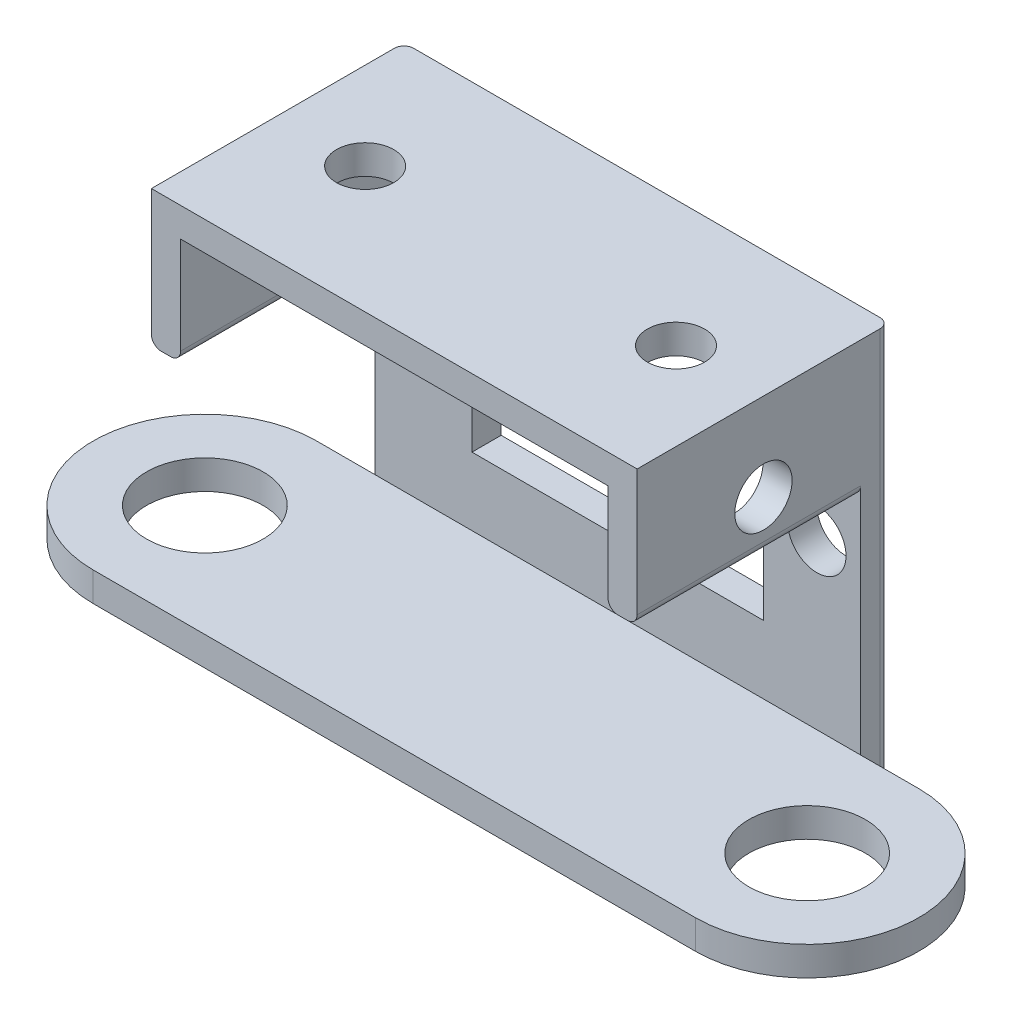
ISO-10303-21;
HEADER;
FILE_DESCRIPTION(('STEP AP214'),'2;1');
FILE_NAME('part.step','',(''),(''),'','','');
FILE_SCHEMA(('AUTOMOTIVE_DESIGN { 1 0 10303 214 1 1 1 1 }'));
ENDSEC;
DATA;
#1=APPLICATION_CONTEXT('core data for automotive mechanical design processes');
#2=APPLICATION_PROTOCOL_DEFINITION('international standard','automotive_design',2000,#1);
#3=PRODUCT_CONTEXT('',#1,'mechanical');
#4=PRODUCT('Part','Part','',(#3));
#5=PRODUCT_RELATED_PRODUCT_CATEGORY('part','',(#4));
#6=PRODUCT_DEFINITION_FORMATION('','',#4);
#7=PRODUCT_DEFINITION_CONTEXT('part definition',#1,'design');
#8=PRODUCT_DEFINITION('design','',#6,#7);
#9=PRODUCT_DEFINITION_SHAPE('','',#8);
#10=(LENGTH_UNIT() NAMED_UNIT(*) SI_UNIT(.MILLI.,.METRE.));
#11=(NAMED_UNIT(*) PLANE_ANGLE_UNIT() SI_UNIT($,.RADIAN.));
#12=(NAMED_UNIT(*) SI_UNIT($,.STERADIAN.) SOLID_ANGLE_UNIT());
#13=UNCERTAINTY_MEASURE_WITH_UNIT(LENGTH_MEASURE(1.E-05),#10,'distance_accuracy_value','');
#14=(GEOMETRIC_REPRESENTATION_CONTEXT(3) GLOBAL_UNCERTAINTY_ASSIGNED_CONTEXT((#13)) GLOBAL_UNIT_ASSIGNED_CONTEXT((#10,
#11,#12)) REPRESENTATION_CONTEXT('',''));
#15=CARTESIAN_POINT('',(0.,0.,0.));
#16=DIRECTION('',(0.,0.,1.));
#17=DIRECTION('',(1.,0.,0.));
#18=AXIS2_PLACEMENT_3D('',#15,#16,#17);
#19=CARTESIAN_POINT('',(-11.5,3.50000000000001,13.));
#20=DIRECTION('',(0.,0.,1.));
#21=DIRECTION('',(1.,0.,0.));
#22=AXIS2_PLACEMENT_3D('',#19,#20,#21);
#23=CYLINDRICAL_SURFACE('',#22,0.5);
#24=DIRECTION('',(0.,0.,1.));
#25=VECTOR('',#24,1.);
#26=CARTESIAN_POINT('',(-11.5,3.00000000000001,13.));
#27=LINE('',#26,#25);
#28=CARTESIAN_POINT('',(-11.5,3.00000000000001,1.5));
#29=VERTEX_POINT('',#28);
#30=CARTESIAN_POINT('',(-11.5,3.00000000000001,13.));
#31=VERTEX_POINT('',#30);
#32=EDGE_CURVE('E425',#29,#31,#27,.T.);
#33=ORIENTED_EDGE('',*,*,#32,.F.);
#34=CARTESIAN_POINT('',(-11.5,3.50000000000001,1.5));
#35=DIRECTION('',(0.,0.,1.));
#36=DIRECTION('',(1.,0.,0.));
#37=AXIS2_PLACEMENT_3D('',#34,#35,#36);
#38=CIRCLE('',#37,0.5);
#39=CARTESIAN_POINT('',(-11.,3.5,1.5));
#40=VERTEX_POINT('',#39);
#41=EDGE_CURVE('E11',#29,#40,#38,.T.);
#42=ORIENTED_EDGE('',*,*,#41,.T.);
#43=DIRECTION('',(0.,0.,1.));
#44=VECTOR('',#43,1.);
#45=CARTESIAN_POINT('',(-11.,3.5,13.));
#46=LINE('',#45,#44);
#47=CARTESIAN_POINT('',(-11.,3.5,13.));
#48=VERTEX_POINT('',#47);
#49=EDGE_CURVE('E428',#48,#40,#46,.F.);
#50=ORIENTED_EDGE('',*,*,#49,.F.);
#51=CARTESIAN_POINT('',(-11.5,3.50000000000001,13.));
#52=DIRECTION('',(0.,0.,1.));
#53=DIRECTION('',(1.,0.,0.));
#54=AXIS2_PLACEMENT_3D('',#51,#52,#53);
#55=CIRCLE('',#54,0.5);
#56=EDGE_CURVE('E48',#31,#48,#55,.T.);
#57=ORIENTED_EDGE('',*,*,#56,.F.);
#58=EDGE_LOOP('',(#33,#42,#50,#57));
#59=FACE_BOUND('',#58,.T.);
#60=ADVANCED_FACE('F41',(#59),#23,.T.);
#61=CARTESIAN_POINT('',(-12.,3.5,13.));
#62=DIRECTION('',(0.,0.,1.));
#63=DIRECTION('',(1.,0.,0.));
#64=AXIS2_PLACEMENT_3D('',#61,#62,#63);
#65=CYLINDRICAL_SURFACE('',#64,0.5);
#66=DIRECTION('',(0.,0.,1.));
#67=VECTOR('',#66,1.);
#68=CARTESIAN_POINT('',(-12.5,3.5,13.));
#69=LINE('',#68,#67);
#70=CARTESIAN_POINT('',(-12.5,3.5,1.5));
#71=VERTEX_POINT('',#70);
#72=CARTESIAN_POINT('',(-12.5,3.5,13.));
#73=VERTEX_POINT('',#72);
#74=EDGE_CURVE('E415',#71,#73,#69,.T.);
#75=ORIENTED_EDGE('',*,*,#74,.F.);
#76=CARTESIAN_POINT('',(-12.,3.5,1.5));
#77=DIRECTION('',(0.,0.,1.));
#78=DIRECTION('',(1.,0.,0.));
#79=AXIS2_PLACEMENT_3D('',#76,#77,#78);
#80=CIRCLE('',#79,0.5);
#81=CARTESIAN_POINT('',(-12.,3.00000000000001,1.5));
#82=VERTEX_POINT('',#81);
#83=EDGE_CURVE('E423',#71,#82,#80,.T.);
#84=ORIENTED_EDGE('',*,*,#83,.T.);
#85=DIRECTION('',(0.,0.,1.));
#86=VECTOR('',#85,1.);
#87=CARTESIAN_POINT('',(-12.,3.00000000000001,13.));
#88=LINE('',#87,#86);
#89=CARTESIAN_POINT('',(-12.,3.00000000000001,13.));
#90=VERTEX_POINT('',#89);
#91=EDGE_CURVE('E418',#90,#82,#88,.F.);
#92=ORIENTED_EDGE('',*,*,#91,.F.);
#93=CARTESIAN_POINT('',(-12.,3.5,13.));
#94=DIRECTION('',(0.,0.,1.));
#95=DIRECTION('',(1.,0.,0.));
#96=AXIS2_PLACEMENT_3D('',#93,#94,#95);
#97=CIRCLE('',#96,0.5);
#98=EDGE_CURVE('E421',#73,#90,#97,.T.);
#99=ORIENTED_EDGE('',*,*,#98,.F.);
#100=EDGE_LOOP('',(#75,#84,#92,#99));
#101=FACE_BOUND('',#100,.T.);
#102=ADVANCED_FACE('F503',(#101),#65,.T.);
#103=CARTESIAN_POINT('',(11.5,3.5,13.));
#104=DIRECTION('',(0.,0.,1.));
#105=DIRECTION('',(1.,0.,0.));
#106=AXIS2_PLACEMENT_3D('',#103,#104,#105);
#107=CYLINDRICAL_SURFACE('',#106,0.5);
#108=DIRECTION('',(0.,0.,1.));
#109=VECTOR('',#108,1.);
#110=CARTESIAN_POINT('',(11.,3.5,13.));
#111=LINE('',#110,#109);
#112=CARTESIAN_POINT('',(11.,3.5,1.5));
#113=VERTEX_POINT('',#112);
#114=CARTESIAN_POINT('',(11.,3.5,13.));
#115=VERTEX_POINT('',#114);
#116=EDGE_CURVE('E405',#113,#115,#111,.T.);
#117=ORIENTED_EDGE('',*,*,#116,.F.);
#118=CARTESIAN_POINT('',(11.5,3.5,1.5));
#119=DIRECTION('',(0.,0.,1.));
#120=DIRECTION('',(1.,0.,0.));
#121=AXIS2_PLACEMENT_3D('',#118,#119,#120);
#122=CIRCLE('',#121,0.5);
#123=CARTESIAN_POINT('',(11.5,3.00000000000001,1.5));
#124=VERTEX_POINT('',#123);
#125=EDGE_CURVE('E413',#113,#124,#122,.T.);
#126=ORIENTED_EDGE('',*,*,#125,.T.);
#127=DIRECTION('',(0.,0.,1.));
#128=VECTOR('',#127,1.);
#129=CARTESIAN_POINT('',(11.5,3.00000000000001,13.));
#130=LINE('',#129,#128);
#131=CARTESIAN_POINT('',(11.5,3.00000000000001,13.));
#132=VERTEX_POINT('',#131);
#133=EDGE_CURVE('E408',#132,#124,#130,.F.);
#134=ORIENTED_EDGE('',*,*,#133,.F.);
#135=CARTESIAN_POINT('',(11.5,3.5,13.));
#136=DIRECTION('',(0.,0.,1.));
#137=DIRECTION('',(1.,0.,0.));
#138=AXIS2_PLACEMENT_3D('',#135,#136,#137);
#139=CIRCLE('',#138,0.5);
#140=EDGE_CURVE('E411',#115,#132,#139,.T.);
#141=ORIENTED_EDGE('',*,*,#140,.F.);
#142=EDGE_LOOP('',(#117,#126,#134,#141));
#143=FACE_BOUND('',#142,.T.);
#144=ADVANCED_FACE('F440',(#143),#107,.T.);
#145=CARTESIAN_POINT('',(12.,3.5,13.));
#146=DIRECTION('',(0.,0.,-1.));
#147=DIRECTION('',(-1.,0.,0.));
#148=AXIS2_PLACEMENT_3D('',#145,#146,#147);
#149=CYLINDRICAL_SURFACE('',#148,0.5);
#150=DIRECTION('',(0.,0.,-1.));
#151=VECTOR('',#150,1.);
#152=CARTESIAN_POINT('',(12.5,3.5,13.));
#153=LINE('',#152,#151);
#154=CARTESIAN_POINT('',(12.5,3.5,13.));
#155=VERTEX_POINT('',#154);
#156=CARTESIAN_POINT('',(12.5,3.5,1.5));
#157=VERTEX_POINT('',#156);
#158=EDGE_CURVE('E394',#155,#157,#153,.T.);
#159=ORIENTED_EDGE('',*,*,#158,.F.);
#160=CARTESIAN_POINT('',(12.,3.5,13.));
#161=DIRECTION('',(0.,0.,1.));
#162=DIRECTION('',(1.,0.,0.));
#163=AXIS2_PLACEMENT_3D('',#160,#161,#162);
#164=CIRCLE('',#163,0.5);
#165=CARTESIAN_POINT('',(12.,3.00000000000001,13.));
#166=VERTEX_POINT('',#165);
#167=EDGE_CURVE('E400',#166,#155,#164,.T.);
#168=ORIENTED_EDGE('',*,*,#167,.F.);
#169=DIRECTION('',(0.,0.,-1.));
#170=VECTOR('',#169,1.);
#171=CARTESIAN_POINT('',(12.,3.00000000000001,13.));
#172=LINE('',#171,#170);
#173=CARTESIAN_POINT('',(12.,3.00000000000001,1.5));
#174=VERTEX_POINT('',#173);
#175=EDGE_CURVE('E397',#174,#166,#172,.F.);
#176=ORIENTED_EDGE('',*,*,#175,.F.);
#177=CARTESIAN_POINT('',(12.,3.5,1.5));
#178=DIRECTION('',(0.,0.,1.));
#179=DIRECTION('',(1.,0.,0.));
#180=AXIS2_PLACEMENT_3D('',#177,#178,#179);
#181=CIRCLE('',#180,0.5);
#182=EDGE_CURVE('E402',#174,#157,#181,.T.);
#183=ORIENTED_EDGE('',*,*,#182,.T.);
#184=EDGE_LOOP('',(#159,#168,#176,#183));
#185=FACE_BOUND('',#184,.T.);
#186=ADVANCED_FACE('F448',(#185),#149,.T.);
#187=CARTESIAN_POINT('',(12.,0.,0.5));
#188=DIRECTION('',(0.,-1.,0.));
#189=DIRECTION('',(1.,0.,0.));
#190=AXIS2_PLACEMENT_3D('',#187,#188,#189);
#191=CYLINDRICAL_SURFACE('',#190,0.5);
#192=DIRECTION('',(0.,-1.,0.));
#193=VECTOR('',#192,1.);
#194=CARTESIAN_POINT('',(12.,0.,0.));
#195=LINE('',#194,#193);
#196=CARTESIAN_POINT('',(12.,10.,0.));
#197=VERTEX_POINT('',#196);
#198=CARTESIAN_POINT('',(12.,-10.,0.));
#199=VERTEX_POINT('',#198);
#200=EDGE_CURVE('E384',#197,#199,#195,.T.);
#201=ORIENTED_EDGE('',*,*,#200,.F.);
#202=CARTESIAN_POINT('',(12.,10.,0.5));
#203=DIRECTION('',(0.,-1.,0.));
#204=DIRECTION('',(0.,0.,-1.));
#205=AXIS2_PLACEMENT_3D('',#202,#203,#204);
#206=CIRCLE('',#205,0.5);
#207=CARTESIAN_POINT('',(12.5,10.,0.5));
#208=VERTEX_POINT('',#207);
#209=EDGE_CURVE('E390',#208,#197,#206,.F.);
#210=ORIENTED_EDGE('',*,*,#209,.F.);
#211=DIRECTION('',(0.,-1.,0.));
#212=VECTOR('',#211,1.);
#213=CARTESIAN_POINT('',(12.5,10.,0.5));
#214=LINE('',#213,#212);
#215=CARTESIAN_POINT('',(12.5,-10.,0.5));
#216=VERTEX_POINT('',#215);
#217=EDGE_CURVE('E387',#216,#208,#214,.F.);
#218=ORIENTED_EDGE('',*,*,#217,.F.);
#219=CARTESIAN_POINT('',(12.,-10.,0.5));
#220=DIRECTION('',(0.,1.,0.));
#221=DIRECTION('',(0.,0.,1.));
#222=AXIS2_PLACEMENT_3D('',#219,#220,#221);
#223=CIRCLE('',#222,0.5);
#224=EDGE_CURVE('E392',#199,#216,#223,.F.);
#225=ORIENTED_EDGE('',*,*,#224,.F.);
#226=EDGE_LOOP('',(#201,#210,#218,#225));
#227=FACE_BOUND('',#226,.T.);
#228=ADVANCED_FACE('F536',(#227),#191,.T.);
#229=CARTESIAN_POINT('',(-12.,10.,0.5));
#230=DIRECTION('',(0.,-1.,0.));
#231=DIRECTION('',(1.,0.,0.));
#232=AXIS2_PLACEMENT_3D('',#229,#230,#231);
#233=CYLINDRICAL_SURFACE('',#232,0.5);
#234=DIRECTION('',(0.,-1.,0.));
#235=VECTOR('',#234,1.);
#236=CARTESIAN_POINT('',(-12.5,10.,0.5));
#237=LINE('',#236,#235);
#238=CARTESIAN_POINT('',(-12.5,10.,0.5));
#239=VERTEX_POINT('',#238);
#240=CARTESIAN_POINT('',(-12.5,-10.,0.5));
#241=VERTEX_POINT('',#240);
#242=EDGE_CURVE('E369',#239,#241,#237,.T.);
#243=ORIENTED_EDGE('',*,*,#242,.F.);
#244=CARTESIAN_POINT('',(-12.,10.,0.5));
#245=DIRECTION('',(0.,-1.,0.));
#246=DIRECTION('',(0.,0.,-1.));
#247=AXIS2_PLACEMENT_3D('',#244,#245,#246);
#248=CIRCLE('',#247,0.5);
#249=CARTESIAN_POINT('',(-12.,10.,0.));
#250=VERTEX_POINT('',#249);
#251=EDGE_CURVE('E380',#250,#239,#248,.F.);
#252=ORIENTED_EDGE('',*,*,#251,.F.);
#253=DIRECTION('',(0.,-1.,0.));
#254=VECTOR('',#253,1.);
#255=CARTESIAN_POINT('',(-12.,0.,0.));
#256=LINE('',#255,#254);
#257=CARTESIAN_POINT('',(-12.,-10.,0.));
#258=VERTEX_POINT('',#257);
#259=EDGE_CURVE('E377',#258,#250,#256,.F.);
#260=ORIENTED_EDGE('',*,*,#259,.F.);
#261=CARTESIAN_POINT('',(-12.,-10.,0.5));
#262=DIRECTION('',(0.,1.,0.));
#263=DIRECTION('',(0.,0.,1.));
#264=AXIS2_PLACEMENT_3D('',#261,#262,#263);
#265=CIRCLE('',#264,0.5);
#266=EDGE_CURVE('E382',#241,#258,#265,.F.);
#267=ORIENTED_EDGE('',*,*,#266,.F.);
#268=EDGE_LOOP('',(#243,#252,#260,#267));
#269=FACE_BOUND('',#268,.T.);
#270=ADVANCED_FACE('F541',(#269),#233,.T.);
#271=CARTESIAN_POINT('',(0.,0.,1.5));
#272=DIRECTION('',(0.,0.,1.));
#273=DIRECTION('',(1.,0.,0.));
#274=AXIS2_PLACEMENT_3D('',#271,#272,#273);
#275=PLANE('',#274);
#276=CARTESIAN_POINT('',(10.25,0.,1.5));
#277=DIRECTION('',(0.,0.,1.));
#278=DIRECTION('',(1.,0.,0.));
#279=AXIS2_PLACEMENT_3D('',#276,#277,#278);
#280=CIRCLE('',#279,1.5);
#281=CARTESIAN_POINT('',(11.75,0.,1.5));
#282=VERTEX_POINT('',#281);
#283=EDGE_CURVE('E364',#282,#282,#280,.T.);
#284=ORIENTED_EDGE('',*,*,#283,.F.);
#285=EDGE_LOOP('',(#284));
#286=FACE_BOUND('',#285,.T.);
#287=DIRECTION('',(0.,1.,0.));
#288=VECTOR('',#287,1.);
#289=CARTESIAN_POINT('',(7.5,5.,1.5));
#290=LINE('',#289,#288);
#291=CARTESIAN_POINT('',(7.5,-5.,1.5));
#292=VERTEX_POINT('',#291);
#293=CARTESIAN_POINT('',(7.5,5.,1.5));
#294=VERTEX_POINT('',#293);
#295=EDGE_CURVE('E301',#292,#294,#290,.T.);
#296=ORIENTED_EDGE('',*,*,#295,.F.);
#297=DIRECTION('',(1.,0.,0.));
#298=VECTOR('',#297,1.);
#299=CARTESIAN_POINT('',(-7.5,-5.,1.5));
#300=LINE('',#299,#298);
#301=CARTESIAN_POINT('',(-7.5,-5.,1.5));
#302=VERTEX_POINT('',#301);
#303=EDGE_CURVE('E309',#302,#292,#300,.T.);
#304=ORIENTED_EDGE('',*,*,#303,.F.);
#305=DIRECTION('',(0.,-1.,0.));
#306=VECTOR('',#305,1.);
#307=CARTESIAN_POINT('',(-7.5,5.,1.5));
#308=LINE('',#307,#306);
#309=CARTESIAN_POINT('',(-7.5,5.,1.5));
#310=VERTEX_POINT('',#309);
#311=EDGE_CURVE('E306',#310,#302,#308,.T.);
#312=ORIENTED_EDGE('',*,*,#311,.F.);
#313=DIRECTION('',(-1.,0.,0.));
#314=VECTOR('',#313,1.);
#315=CARTESIAN_POINT('',(-7.5,5.,1.5));
#316=LINE('',#315,#314);
#317=EDGE_CURVE('E303',#294,#310,#316,.T.);
#318=ORIENTED_EDGE('',*,*,#317,.F.);
#319=EDGE_LOOP('',(#296,#304,#312,#318));
#320=FACE_BOUND('',#319,.T.);
#321=CARTESIAN_POINT('',(-10.25,0.,1.5));
#322=DIRECTION('',(0.,0.,1.));
#323=DIRECTION('',(1.,0.,0.));
#324=AXIS2_PLACEMENT_3D('',#321,#322,#323);
#325=CIRCLE('',#324,1.5);
#326=CARTESIAN_POINT('',(-8.75,0.,1.5));
#327=VERTEX_POINT('',#326);
#328=EDGE_CURVE('E336',#327,#327,#325,.T.);
#329=ORIENTED_EDGE('',*,*,#328,.F.);
#330=EDGE_LOOP('',(#329));
#331=FACE_BOUND('',#330,.T.);
#332=DIRECTION('',(0.,1.,0.));
#333=VECTOR('',#332,1.);
#334=CARTESIAN_POINT('',(-11.,8.5,1.5));
#335=LINE('',#334,#333);
#336=CARTESIAN_POINT('',(-11.,8.5,1.5));
#337=VERTEX_POINT('',#336);
#338=EDGE_CURVE('E216',#40,#337,#335,.T.);
#339=ORIENTED_EDGE('',*,*,#338,.F.);
#340=ORIENTED_EDGE('',*,*,#41,.F.);
#341=DIRECTION('',(1.,0.,0.));
#342=VECTOR('',#341,1.);
#343=CARTESIAN_POINT('',(-11.,3.00000000000001,1.5));
#344=LINE('',#343,#342);
#345=EDGE_CURVE('E237',#82,#29,#344,.T.);
#346=ORIENTED_EDGE('',*,*,#345,.F.);
#347=ORIENTED_EDGE('',*,*,#83,.F.);
#348=DIRECTION('',(0.,1.,0.));
#349=VECTOR('',#348,1.);
#350=CARTESIAN_POINT('',(-12.5,10.,1.5));
#351=LINE('',#350,#349);
#352=CARTESIAN_POINT('',(-12.5,-8.5,1.5));
#353=VERTEX_POINT('',#352);
#354=EDGE_CURVE('E297',#353,#71,#351,.T.);
#355=ORIENTED_EDGE('',*,*,#354,.F.);
#356=DIRECTION('',(1.,0.,0.));
#357=VECTOR('',#356,1.);
#358=CARTESIAN_POINT('',(-12.5,-8.5,1.5));
#359=LINE('',#358,#357);
#360=CARTESIAN_POINT('',(12.5,-8.49999999999999,1.5));
#361=VERTEX_POINT('',#360);
#362=EDGE_CURVE('E340',#353,#361,#359,.T.);
#363=ORIENTED_EDGE('',*,*,#362,.T.);
#364=DIRECTION('',(0.,-1.,0.));
#365=VECTOR('',#364,1.);
#366=CARTESIAN_POINT('',(12.5,10.,1.5));
#367=LINE('',#366,#365);
#368=EDGE_CURVE('E299',#157,#361,#367,.T.);
#369=ORIENTED_EDGE('',*,*,#368,.F.);
#370=ORIENTED_EDGE('',*,*,#182,.F.);
#371=DIRECTION('',(1.,0.,0.));
#372=VECTOR('',#371,1.);
#373=CARTESIAN_POINT('',(11.,3.00000000000001,1.5));
#374=LINE('',#373,#372);
#375=EDGE_CURVE('E247',#124,#174,#374,.T.);
#376=ORIENTED_EDGE('',*,*,#375,.F.);
#377=ORIENTED_EDGE('',*,*,#125,.F.);
#378=DIRECTION('',(0.,-1.,0.));
#379=VECTOR('',#378,1.);
#380=CARTESIAN_POINT('',(11.,8.5,1.5));
#381=LINE('',#380,#379);
#382=CARTESIAN_POINT('',(11.,8.5,1.5));
#383=VERTEX_POINT('',#382);
#384=EDGE_CURVE('E244',#383,#113,#381,.T.);
#385=ORIENTED_EDGE('',*,*,#384,.F.);
#386=DIRECTION('',(1.,0.,0.));
#387=VECTOR('',#386,1.);
#388=CARTESIAN_POINT('',(-11.,8.5,1.5));
#389=LINE('',#388,#387);
#390=EDGE_CURVE('E242',#337,#383,#389,.T.);
#391=ORIENTED_EDGE('',*,*,#390,.F.);
#392=EDGE_LOOP('',(#339,#340,#346,#347,#355,#363,#369,#370,#376,#377,#385,#391));
#393=FACE_BOUND('',#392,.T.);
#394=ADVANCED_FACE('F430',(#286,#320,#331,#393),#275,.T.);
#395=CARTESIAN_POINT('',(12.5,10.,13.));
#396=DIRECTION('',(-1.,0.,0.));
#397=DIRECTION('',(0.,-1.,0.));
#398=AXIS2_PLACEMENT_3D('',#395,#396,#397);
#399=PLANE('',#398);
#400=CARTESIAN_POINT('',(12.5,5.5,6.5));
#401=DIRECTION('',(-1.,0.,0.));
#402=DIRECTION('',(0.,-1.,0.));
#403=AXIS2_PLACEMENT_3D('',#400,#401,#402);
#404=CIRCLE('',#403,1.475);
#405=CARTESIAN_POINT('',(12.5,4.025,6.5));
#406=VERTEX_POINT('',#405);
#407=EDGE_CURVE('E475',#406,#406,#404,.T.);
#408=ORIENTED_EDGE('',*,*,#407,.T.);
#409=EDGE_LOOP('',(#408));
#410=FACE_BOUND('',#409,.T.);
#411=DIRECTION('',(0.,1.,0.));
#412=VECTOR('',#411,1.);
#413=CARTESIAN_POINT('',(12.5,3.00000000000001,13.));
#414=LINE('',#413,#412);
#415=CARTESIAN_POINT('',(12.5,10.,13.));
#416=VERTEX_POINT('',#415);
#417=EDGE_CURVE('E232',#155,#416,#414,.T.);
#418=ORIENTED_EDGE('',*,*,#417,.F.);
#419=ORIENTED_EDGE('',*,*,#158,.T.);
#420=ORIENTED_EDGE('',*,*,#368,.T.);
#421=DIRECTION('',(0.,-1.,0.));
#422=VECTOR('',#421,1.);
#423=CARTESIAN_POINT('',(12.5,10.,1.5));
#424=LINE('',#423,#422);
#425=CARTESIAN_POINT('',(12.5,-10.,1.50000000000003));
#426=VERTEX_POINT('',#425);
#427=EDGE_CURVE('E295',#361,#426,#424,.T.);
#428=ORIENTED_EDGE('',*,*,#427,.T.);
#429=DIRECTION('',(0.,0.,-1.));
#430=VECTOR('',#429,1.);
#431=CARTESIAN_POINT('',(12.5,-10.,13.));
#432=LINE('',#431,#430);
#433=EDGE_CURVE('E348',#426,#216,#432,.T.);
#434=ORIENTED_EDGE('',*,*,#433,.T.);
#435=ORIENTED_EDGE('',*,*,#217,.T.);
#436=DIRECTION('',(0.,0.,-1.));
#437=VECTOR('',#436,1.);
#438=CARTESIAN_POINT('',(12.5,10.,13.));
#439=LINE('',#438,#437);
#440=EDGE_CURVE('E361',#416,#208,#439,.T.);
#441=ORIENTED_EDGE('',*,*,#440,.F.);
#442=EDGE_LOOP('',(#418,#419,#420,#428,#434,#435,#441));
#443=FACE_BOUND('',#442,.T.);
#444=ADVANCED_FACE('F455',(#410,#443),#399,.F.);
#445=CARTESIAN_POINT('',(-12.5,10.,13.));
#446=DIRECTION('',(0.,-1.,0.));
#447=DIRECTION('',(0.,0.,-1.));
#448=AXIS2_PLACEMENT_3D('',#445,#446,#447);
#449=PLANE('',#448);
#450=CARTESIAN_POINT('',(8.,10.,6.5));
#451=DIRECTION('',(0.,1.,0.));
#452=DIRECTION('',(0.,0.,-1.));
#453=AXIS2_PLACEMENT_3D('',#450,#451,#452);
#454=CIRCLE('',#453,1.475);
#455=CARTESIAN_POINT('',(8.,10.,5.025));
#456=VERTEX_POINT('',#455);
#457=EDGE_CURVE('E472',#456,#456,#454,.T.);
#458=ORIENTED_EDGE('',*,*,#457,.F.);
#459=EDGE_LOOP('',(#458));
#460=FACE_BOUND('',#459,.T.);
#461=CARTESIAN_POINT('',(-8.,10.,6.5));
#462=DIRECTION('',(0.,1.,0.));
#463=DIRECTION('',(0.,0.,1.));
#464=AXIS2_PLACEMENT_3D('',#461,#462,#463);
#465=CIRCLE('',#464,1.475);
#466=CARTESIAN_POINT('',(-8.,10.,7.975));
#467=VERTEX_POINT('',#466);
#468=EDGE_CURVE('E466',#467,#467,#465,.T.);
#469=ORIENTED_EDGE('',*,*,#468,.F.);
#470=EDGE_LOOP('',(#469));
#471=FACE_BOUND('',#470,.T.);
#472=ORIENTED_EDGE('',*,*,#440,.T.);
#473=ORIENTED_EDGE('',*,*,#209,.T.);
#474=DIRECTION('',(-1.,0.,0.));
#475=VECTOR('',#474,1.);
#476=CARTESIAN_POINT('',(-12.5,10.,0.));
#477=LINE('',#476,#475);
#478=EDGE_CURVE('E345',#197,#250,#477,.T.);
#479=ORIENTED_EDGE('',*,*,#478,.T.);
#480=ORIENTED_EDGE('',*,*,#251,.T.);
#481=DIRECTION('',(0.,0.,-1.));
#482=VECTOR('',#481,1.);
#483=CARTESIAN_POINT('',(-12.5,10.,13.));
#484=LINE('',#483,#482);
#485=CARTESIAN_POINT('',(-12.5,10.,13.));
#486=VERTEX_POINT('',#485);
#487=EDGE_CURVE('E358',#486,#239,#484,.T.);
#488=ORIENTED_EDGE('',*,*,#487,.F.);
#489=DIRECTION('',(-1.,0.,0.));
#490=VECTOR('',#489,1.);
#491=CARTESIAN_POINT('',(12.5,10.,13.));
#492=LINE('',#491,#490);
#493=EDGE_CURVE('E234',#416,#486,#492,.T.);
#494=ORIENTED_EDGE('',*,*,#493,.F.);
#495=EDGE_LOOP('',(#472,#473,#479,#480,#488,#494));
#496=FACE_BOUND('',#495,.T.);
#497=ADVANCED_FACE('F458',(#460,#471,#496),#449,.F.);
#498=CARTESIAN_POINT('',(-12.5,10.,13.));
#499=DIRECTION('',(1.,0.,0.));
#500=DIRECTION('',(0.,1.,0.));
#501=AXIS2_PLACEMENT_3D('',#498,#499,#500);
#502=PLANE('',#501);
#503=CARTESIAN_POINT('',(-12.5,5.5,6.5));
#504=DIRECTION('',(-1.,0.,0.));
#505=DIRECTION('',(0.,-1.,0.));
#506=AXIS2_PLACEMENT_3D('',#503,#504,#505);
#507=CIRCLE('',#506,1.475);
#508=CARTESIAN_POINT('',(-12.5,4.025,6.5));
#509=VERTEX_POINT('',#508);
#510=EDGE_CURVE('E374',#509,#509,#507,.T.);
#511=ORIENTED_EDGE('',*,*,#510,.F.);
#512=EDGE_LOOP('',(#511));
#513=FACE_BOUND('',#512,.T.);
#514=ORIENTED_EDGE('',*,*,#354,.T.);
#515=ORIENTED_EDGE('',*,*,#74,.T.);
#516=DIRECTION('',(0.,-1.,0.));
#517=VECTOR('',#516,1.);
#518=CARTESIAN_POINT('',(-12.5,3.00000000000001,13.));
#519=LINE('',#518,#517);
#520=EDGE_CURVE('E249',#486,#73,#519,.T.);
#521=ORIENTED_EDGE('',*,*,#520,.F.);
#522=ORIENTED_EDGE('',*,*,#487,.T.);
#523=ORIENTED_EDGE('',*,*,#242,.T.);
#524=DIRECTION('',(0.,0.,-1.));
#525=VECTOR('',#524,1.);
#526=CARTESIAN_POINT('',(-12.5,-10.,13.));
#527=LINE('',#526,#525);
#528=CARTESIAN_POINT('',(-12.5,-10.,1.50000000000003));
#529=VERTEX_POINT('',#528);
#530=EDGE_CURVE('E355',#529,#241,#527,.T.);
#531=ORIENTED_EDGE('',*,*,#530,.F.);
#532=DIRECTION('',(0.,1.,0.));
#533=VECTOR('',#532,1.);
#534=CARTESIAN_POINT('',(-12.5,10.,1.50000000000005));
#535=LINE('',#534,#533);
#536=EDGE_CURVE('E285',#529,#353,#535,.T.);
#537=ORIENTED_EDGE('',*,*,#536,.T.);
#538=EDGE_LOOP('',(#514,#515,#521,#522,#523,#531,#537));
#539=FACE_BOUND('',#538,.T.);
#540=ADVANCED_FACE('F462',(#513,#539),#502,.F.);
#541=CARTESIAN_POINT('',(-12.5,-10.,13.));
#542=DIRECTION('',(0.,1.,0.));
#543=DIRECTION('',(0.,0.,1.));
#544=AXIS2_PLACEMENT_3D('',#541,#542,#543);
#545=PLANE('',#544);
#546=CARTESIAN_POINT('',(15.5,-10.,7.25));
#547=DIRECTION('',(0.,1.,0.));
#548=DIRECTION('',(0.,0.,1.));
#549=AXIS2_PLACEMENT_3D('',#546,#547,#548);
#550=CIRCLE('',#549,3.);
#551=CARTESIAN_POINT('',(15.5,-10.,10.25));
#552=VERTEX_POINT('',#551);
#553=EDGE_CURVE('E265',#552,#552,#550,.F.);
#554=ORIENTED_EDGE('',*,*,#553,.F.);
#555=EDGE_LOOP('',(#554));
#556=FACE_BOUND('',#555,.T.);
#557=CARTESIAN_POINT('',(-15.5,-10.,7.25));
#558=DIRECTION('',(0.,1.,0.));
#559=DIRECTION('',(0.,0.,1.));
#560=AXIS2_PLACEMENT_3D('',#557,#558,#559);
#561=CIRCLE('',#560,3.);
#562=CARTESIAN_POINT('',(-15.5,-10.,10.25));
#563=VERTEX_POINT('',#562);
#564=EDGE_CURVE('E251',#563,#563,#561,.T.);
#565=ORIENTED_EDGE('',*,*,#564,.T.);
#566=EDGE_LOOP('',(#565));
#567=FACE_BOUND('',#566,.T.);
#568=DIRECTION('',(1.,0.,0.));
#569=VECTOR('',#568,1.);
#570=CARTESIAN_POINT('',(-12.5,-10.,0.));
#571=LINE('',#570,#569);
#572=EDGE_CURVE('E349',#258,#199,#571,.T.);
#573=ORIENTED_EDGE('',*,*,#572,.T.);
#574=ORIENTED_EDGE('',*,*,#224,.T.);
#575=ORIENTED_EDGE('',*,*,#433,.F.);
#576=DIRECTION('',(-1.,0.,0.));
#577=VECTOR('',#576,1.);
#578=CARTESIAN_POINT('',(0.,-10.,1.50000000000002));
#579=LINE('',#578,#577);
#580=CARTESIAN_POINT('',(15.5,-10.,1.49999999999999));
#581=VERTEX_POINT('',#580);
#582=EDGE_CURVE('E256',#581,#426,#579,.T.);
#583=ORIENTED_EDGE('',*,*,#582,.F.);
#584=CARTESIAN_POINT('',(15.5,-10.,7.25));
#585=DIRECTION('',(0.,1.,0.));
#586=DIRECTION('',(0.,0.,1.));
#587=AXIS2_PLACEMENT_3D('',#584,#585,#586);
#588=CIRCLE('',#587,5.75);
#589=CARTESIAN_POINT('',(15.5,-10.,13.));
#590=VERTEX_POINT('',#589);
#591=EDGE_CURVE('E262',#581,#590,#588,.F.);
#592=ORIENTED_EDGE('',*,*,#591,.T.);
#593=DIRECTION('',(1.,0.,0.));
#594=VECTOR('',#593,1.);
#595=CARTESIAN_POINT('',(-12.5,-10.,13.));
#596=LINE('',#595,#594);
#597=CARTESIAN_POINT('',(-15.5,-10.,13.));
#598=VERTEX_POINT('',#597);
#599=EDGE_CURVE('E346',#598,#590,#596,.T.);
#600=ORIENTED_EDGE('',*,*,#599,.F.);
#601=CARTESIAN_POINT('',(-15.5,-10.,7.25));
#602=DIRECTION('',(0.,1.,0.));
#603=DIRECTION('',(0.,0.,1.));
#604=AXIS2_PLACEMENT_3D('',#601,#602,#603);
#605=CIRCLE('',#604,5.75);
#606=CARTESIAN_POINT('',(-15.5,-10.,1.5));
#607=VERTEX_POINT('',#606);
#608=EDGE_CURVE('E259',#607,#598,#605,.T.);
#609=ORIENTED_EDGE('',*,*,#608,.F.);
#610=EDGE_CURVE('E254',#529,#607,#579,.T.);
#611=ORIENTED_EDGE('',*,*,#610,.F.);
#612=ORIENTED_EDGE('',*,*,#530,.T.);
#613=ORIENTED_EDGE('',*,*,#266,.T.);
#614=EDGE_LOOP('',(#573,#574,#575,#583,#592,#600,#609,#611,#612,#613));
#615=FACE_BOUND('',#614,.T.);
#616=ADVANCED_FACE('F489',(#556,#567,#615),#545,.F.);
#617=CARTESIAN_POINT('',(0.,0.,13.));
#618=DIRECTION('',(0.,0.,1.));
#619=DIRECTION('',(1.,0.,0.));
#620=AXIS2_PLACEMENT_3D('',#617,#618,#619);
#621=PLANE('',#620);
#622=DIRECTION('',(1.,0.,0.));
#623=VECTOR('',#622,1.);
#624=CARTESIAN_POINT('',(-12.5,-8.5,13.));
#625=LINE('',#624,#623);
#626=CARTESIAN_POINT('',(-15.5,-8.5,13.));
#627=VERTEX_POINT('',#626);
#628=CARTESIAN_POINT('',(15.5,-8.5,13.));
#629=VERTEX_POINT('',#628);
#630=EDGE_CURVE('E343',#627,#629,#625,.T.);
#631=ORIENTED_EDGE('',*,*,#630,.F.);
#632=DIRECTION('',(0.,1.,0.));
#633=VECTOR('',#632,1.);
#634=CARTESIAN_POINT('',(-15.5,-10.,13.));
#635=LINE('',#634,#633);
#636=EDGE_CURVE('E289',#598,#627,#635,.T.);
#637=ORIENTED_EDGE('',*,*,#636,.F.);
#638=ORIENTED_EDGE('',*,*,#599,.T.);
#639=DIRECTION('',(0.,1.,0.));
#640=VECTOR('',#639,1.);
#641=CARTESIAN_POINT('',(15.5,-10.,13.));
#642=LINE('',#641,#640);
#643=EDGE_CURVE('E286',#590,#629,#642,.T.);
#644=ORIENTED_EDGE('',*,*,#643,.T.);
#645=EDGE_LOOP('',(#631,#637,#638,#644));
#646=FACE_BOUND('',#645,.T.);
#647=ADVANCED_FACE('F496',(#646),#621,.T.);
#648=CARTESIAN_POINT('',(0.,0.,0.));
#649=DIRECTION('',(0.,0.,1.));
#650=DIRECTION('',(1.,0.,0.));
#651=AXIS2_PLACEMENT_3D('',#648,#649,#650);
#652=PLANE('',#651);
#653=DIRECTION('',(1.,0.,0.));
#654=VECTOR('',#653,1.);
#655=CARTESIAN_POINT('',(0.,-5.,0.));
#656=LINE('',#655,#654);
#657=CARTESIAN_POINT('',(-7.5,-5.,0.));
#658=VERTEX_POINT('',#657);
#659=CARTESIAN_POINT('',(7.5,-5.,0.));
#660=VERTEX_POINT('',#659);
#661=EDGE_CURVE('E327',#658,#660,#656,.T.);
#662=ORIENTED_EDGE('',*,*,#661,.T.);
#663=DIRECTION('',(0.,1.,0.));
#664=VECTOR('',#663,1.);
#665=CARTESIAN_POINT('',(7.5,0.,0.));
#666=LINE('',#665,#664);
#667=CARTESIAN_POINT('',(7.5,5.,0.));
#668=VERTEX_POINT('',#667);
#669=EDGE_CURVE('E330',#660,#668,#666,.T.);
#670=ORIENTED_EDGE('',*,*,#669,.T.);
#671=DIRECTION('',(-1.,0.,0.));
#672=VECTOR('',#671,1.);
#673=CARTESIAN_POINT('',(0.,5.,0.));
#674=LINE('',#673,#672);
#675=CARTESIAN_POINT('',(-7.5,5.,0.));
#676=VERTEX_POINT('',#675);
#677=EDGE_CURVE('E315',#668,#676,#674,.T.);
#678=ORIENTED_EDGE('',*,*,#677,.T.);
#679=DIRECTION('',(0.,-1.,0.));
#680=VECTOR('',#679,1.);
#681=CARTESIAN_POINT('',(-7.5,0.,0.));
#682=LINE('',#681,#680);
#683=EDGE_CURVE('E324',#676,#658,#682,.T.);
#684=ORIENTED_EDGE('',*,*,#683,.T.);
#685=EDGE_LOOP('',(#662,#670,#678,#684));
#686=FACE_BOUND('',#685,.T.);
#687=CARTESIAN_POINT('',(10.25,0.,0.));
#688=DIRECTION('',(0.,0.,1.));
#689=DIRECTION('',(1.,0.,0.));
#690=AXIS2_PLACEMENT_3D('',#687,#688,#689);
#691=CIRCLE('',#690,1.5);
#692=CARTESIAN_POINT('',(11.75,0.,0.));
#693=VERTEX_POINT('',#692);
#694=EDGE_CURVE('E333',#693,#693,#691,.T.);
#695=ORIENTED_EDGE('',*,*,#694,.T.);
#696=EDGE_LOOP('',(#695));
#697=FACE_BOUND('',#696,.T.);
#698=CARTESIAN_POINT('',(-10.25,0.,0.));
#699=DIRECTION('',(0.,0.,1.));
#700=DIRECTION('',(1.,0.,0.));
#701=AXIS2_PLACEMENT_3D('',#698,#699,#700);
#702=CIRCLE('',#701,1.5);
#703=CARTESIAN_POINT('',(-8.75,0.,0.));
#704=VERTEX_POINT('',#703);
#705=EDGE_CURVE('E339',#704,#704,#702,.T.);
#706=ORIENTED_EDGE('',*,*,#705,.T.);
#707=EDGE_LOOP('',(#706));
#708=FACE_BOUND('',#707,.T.);
#709=ORIENTED_EDGE('',*,*,#478,.F.);
#710=ORIENTED_EDGE('',*,*,#200,.T.);
#711=ORIENTED_EDGE('',*,*,#572,.F.);
#712=ORIENTED_EDGE('',*,*,#259,.T.);
#713=EDGE_LOOP('',(#709,#710,#711,#712));
#714=FACE_BOUND('',#713,.T.);
#715=ADVANCED_FACE('F542',(#686,#697,#708,#714),#652,.F.);
#716=CARTESIAN_POINT('',(-12.5,-8.5,13.));
#717=DIRECTION('',(0.,1.,0.));
#718=DIRECTION('',(0.,0.,1.));
#719=AXIS2_PLACEMENT_3D('',#716,#717,#718);
#720=PLANE('',#719);
#721=CARTESIAN_POINT('',(15.5,-8.5,7.25));
#722=DIRECTION('',(0.,1.,0.));
#723=DIRECTION('',(0.,0.,1.));
#724=AXIS2_PLACEMENT_3D('',#721,#722,#723);
#725=CIRCLE('',#724,3.);
#726=CARTESIAN_POINT('',(15.5,-8.5,10.25));
#727=VERTEX_POINT('',#726);
#728=EDGE_CURVE('E255',#727,#727,#725,.F.);
#729=ORIENTED_EDGE('',*,*,#728,.T.);
#730=EDGE_LOOP('',(#729));
#731=FACE_BOUND('',#730,.T.);
#732=CARTESIAN_POINT('',(-15.5,-8.5,7.25));
#733=DIRECTION('',(0.,1.,0.));
#734=DIRECTION('',(0.,0.,1.));
#735=AXIS2_PLACEMENT_3D('',#732,#733,#734);
#736=CIRCLE('',#735,3.);
#737=CARTESIAN_POINT('',(-15.5,-8.5,10.25));
#738=VERTEX_POINT('',#737);
#739=EDGE_CURVE('E219',#738,#738,#736,.T.);
#740=ORIENTED_EDGE('',*,*,#739,.F.);
#741=EDGE_LOOP('',(#740));
#742=FACE_BOUND('',#741,.T.);
#743=ORIENTED_EDGE('',*,*,#362,.F.);
#744=DIRECTION('',(-1.,0.,0.));
#745=VECTOR('',#744,1.);
#746=CARTESIAN_POINT('',(0.,-8.5,1.50000000000002));
#747=LINE('',#746,#745);
#748=CARTESIAN_POINT('',(-15.5,-8.5,1.5));
#749=VERTEX_POINT('',#748);
#750=EDGE_CURVE('E271',#353,#749,#747,.T.);
#751=ORIENTED_EDGE('',*,*,#750,.T.);
#752=CARTESIAN_POINT('',(-15.5,-8.5,7.25));
#753=DIRECTION('',(0.,1.,0.));
#754=DIRECTION('',(0.,0.,1.));
#755=AXIS2_PLACEMENT_3D('',#752,#753,#754);
#756=CIRCLE('',#755,5.75);
#757=EDGE_CURVE('E275',#749,#627,#756,.T.);
#758=ORIENTED_EDGE('',*,*,#757,.T.);
#759=ORIENTED_EDGE('',*,*,#630,.T.);
#760=CARTESIAN_POINT('',(15.5,-8.5,7.25));
#761=DIRECTION('',(0.,1.,0.));
#762=DIRECTION('',(0.,0.,1.));
#763=AXIS2_PLACEMENT_3D('',#760,#761,#762);
#764=CIRCLE('',#763,5.75);
#765=CARTESIAN_POINT('',(15.5,-8.5,1.49999999999999));
#766=VERTEX_POINT('',#765);
#767=EDGE_CURVE('E278',#766,#629,#764,.F.);
#768=ORIENTED_EDGE('',*,*,#767,.F.);
#769=EDGE_CURVE('E272',#766,#361,#747,.T.);
#770=ORIENTED_EDGE('',*,*,#769,.T.);
#771=EDGE_LOOP('',(#743,#751,#758,#759,#768,#770));
#772=FACE_BOUND('',#771,.T.);
#773=ADVANCED_FACE('F524',(#731,#742,#772),#720,.T.);
#774=CARTESIAN_POINT('',(-10.25,0.,-3.5));
#775=DIRECTION('',(0.,0.,1.));
#776=DIRECTION('',(1.,0.,0.));
#777=AXIS2_PLACEMENT_3D('',#774,#775,#776);
#778=CYLINDRICAL_SURFACE('',#777,1.5);
#779=ORIENTED_EDGE('',*,*,#328,.T.);
#780=EDGE_LOOP('',(#779));
#781=FACE_BOUND('',#780,.T.);
#782=ORIENTED_EDGE('',*,*,#705,.F.);
#783=EDGE_LOOP('',(#782));
#784=FACE_BOUND('',#783,.T.);
#785=ADVANCED_FACE('F550',(#781,#784),#778,.F.);
#786=CARTESIAN_POINT('',(10.25,0.,-3.5));
#787=DIRECTION('',(0.,0.,1.));
#788=DIRECTION('',(1.,0.,0.));
#789=AXIS2_PLACEMENT_3D('',#786,#787,#788);
#790=CYLINDRICAL_SURFACE('',#789,1.5);
#791=ORIENTED_EDGE('',*,*,#283,.T.);
#792=EDGE_LOOP('',(#791));
#793=FACE_BOUND('',#792,.T.);
#794=ORIENTED_EDGE('',*,*,#694,.F.);
#795=EDGE_LOOP('',(#794));
#796=FACE_BOUND('',#795,.T.);
#797=ADVANCED_FACE('F563',(#793,#796),#790,.F.);
#798=CARTESIAN_POINT('',(7.5,5.,-0.5));
#799=DIRECTION('',(1.,0.,0.));
#800=DIRECTION('',(0.,1.,0.));
#801=AXIS2_PLACEMENT_3D('',#798,#799,#800);
#802=PLANE('',#801);
#803=DIRECTION('',(0.,0.,1.));
#804=VECTOR('',#803,1.);
#805=CARTESIAN_POINT('',(7.5,-5.,-0.5));
#806=LINE('',#805,#804);
#807=EDGE_CURVE('E313',#660,#292,#806,.T.);
#808=ORIENTED_EDGE('',*,*,#807,.T.);
#809=ORIENTED_EDGE('',*,*,#295,.T.);
#810=DIRECTION('',(0.,0.,1.));
#811=VECTOR('',#810,1.);
#812=CARTESIAN_POINT('',(7.5,5.,-0.5));
#813=LINE('',#812,#811);
#814=EDGE_CURVE('E312',#668,#294,#813,.T.);
#815=ORIENTED_EDGE('',*,*,#814,.F.);
#816=ORIENTED_EDGE('',*,*,#669,.F.);
#817=EDGE_LOOP('',(#808,#809,#815,#816));
#818=FACE_BOUND('',#817,.T.);
#819=ADVANCED_FACE('F567',(#818),#802,.F.);
#820=CARTESIAN_POINT('',(-7.5,-5.,-0.5));
#821=DIRECTION('',(0.,-1.,0.));
#822=DIRECTION('',(0.,0.,-1.));
#823=AXIS2_PLACEMENT_3D('',#820,#821,#822);
#824=PLANE('',#823);
#825=DIRECTION('',(0.,0.,1.));
#826=VECTOR('',#825,1.);
#827=CARTESIAN_POINT('',(-7.5,-5.,-0.5));
#828=LINE('',#827,#826);
#829=EDGE_CURVE('E316',#658,#302,#828,.T.);
#830=ORIENTED_EDGE('',*,*,#829,.T.);
#831=ORIENTED_EDGE('',*,*,#303,.T.);
#832=ORIENTED_EDGE('',*,*,#807,.F.);
#833=ORIENTED_EDGE('',*,*,#661,.F.);
#834=EDGE_LOOP('',(#830,#831,#832,#833));
#835=FACE_BOUND('',#834,.T.);
#836=ADVANCED_FACE('F571',(#835),#824,.F.);
#837=CARTESIAN_POINT('',(-7.5,5.,-0.5));
#838=DIRECTION('',(-1.,0.,0.));
#839=DIRECTION('',(0.,-1.,0.));
#840=AXIS2_PLACEMENT_3D('',#837,#838,#839);
#841=PLANE('',#840);
#842=DIRECTION('',(0.,0.,1.));
#843=VECTOR('',#842,1.);
#844=CARTESIAN_POINT('',(-7.5,5.,-0.5));
#845=LINE('',#844,#843);
#846=EDGE_CURVE('E318',#676,#310,#845,.T.);
#847=ORIENTED_EDGE('',*,*,#846,.T.);
#848=ORIENTED_EDGE('',*,*,#311,.T.);
#849=ORIENTED_EDGE('',*,*,#829,.F.);
#850=ORIENTED_EDGE('',*,*,#683,.F.);
#851=EDGE_LOOP('',(#847,#848,#849,#850));
#852=FACE_BOUND('',#851,.T.);
#853=ADVANCED_FACE('F577',(#852),#841,.F.);
#854=CARTESIAN_POINT('',(-7.5,5.,-0.5));
#855=DIRECTION('',(0.,1.,0.));
#856=DIRECTION('',(0.,0.,1.));
#857=AXIS2_PLACEMENT_3D('',#854,#855,#856);
#858=PLANE('',#857);
#859=ORIENTED_EDGE('',*,*,#814,.T.);
#860=ORIENTED_EDGE('',*,*,#317,.T.);
#861=ORIENTED_EDGE('',*,*,#846,.F.);
#862=ORIENTED_EDGE('',*,*,#677,.F.);
#863=EDGE_LOOP('',(#859,#860,#861,#862));
#864=FACE_BOUND('',#863,.T.);
#865=ADVANCED_FACE('F573',(#864),#858,.F.);
#866=CARTESIAN_POINT('',(-15.5,-10.,7.25));
#867=DIRECTION('',(0.,1.,0.));
#868=DIRECTION('',(0.,0.,1.));
#869=AXIS2_PLACEMENT_3D('',#866,#867,#868);
#870=CYLINDRICAL_SURFACE('',#869,3.);
#871=ORIENTED_EDGE('',*,*,#739,.T.);
#872=EDGE_LOOP('',(#871));
#873=FACE_BOUND('',#872,.T.);
#874=ORIENTED_EDGE('',*,*,#564,.F.);
#875=EDGE_LOOP('',(#874));
#876=FACE_BOUND('',#875,.T.);
#877=ADVANCED_FACE('F576',(#873,#876),#870,.F.);
#878=CARTESIAN_POINT('',(-15.5,-10.,7.25));
#879=DIRECTION('',(0.,1.,0.));
#880=DIRECTION('',(0.,0.,1.));
#881=AXIS2_PLACEMENT_3D('',#878,#879,#880);
#882=CYLINDRICAL_SURFACE('',#881,5.75);
#883=ORIENTED_EDGE('',*,*,#757,.F.);
#884=DIRECTION('',(0.,1.,0.));
#885=VECTOR('',#884,1.);
#886=CARTESIAN_POINT('',(-15.5,-10.,1.5));
#887=LINE('',#886,#885);
#888=EDGE_CURVE('E268',#607,#749,#887,.T.);
#889=ORIENTED_EDGE('',*,*,#888,.F.);
#890=ORIENTED_EDGE('',*,*,#608,.T.);
#891=ORIENTED_EDGE('',*,*,#636,.T.);
#892=EDGE_LOOP('',(#883,#889,#890,#891));
#893=FACE_BOUND('',#892,.T.);
#894=ADVANCED_FACE('F587',(#893),#882,.T.);
#895=CARTESIAN_POINT('',(0.,-10.,1.50000000000002));
#896=DIRECTION('',(0.,0.,-1.));
#897=DIRECTION('',(-1.,0.,0.));
#898=AXIS2_PLACEMENT_3D('',#895,#896,#897);
#899=PLANE('',#898);
#900=ORIENTED_EDGE('',*,*,#536,.F.);
#901=ORIENTED_EDGE('',*,*,#610,.T.);
#902=ORIENTED_EDGE('',*,*,#888,.T.);
#903=ORIENTED_EDGE('',*,*,#750,.F.);
#904=EDGE_LOOP('',(#900,#901,#902,#903));
#905=FACE_BOUND('',#904,.T.);
#906=ADVANCED_FACE('F519',(#905),#899,.T.);
#907=ORIENTED_EDGE('',*,*,#427,.F.);
#908=ORIENTED_EDGE('',*,*,#769,.F.);
#909=DIRECTION('',(0.,1.,0.));
#910=VECTOR('',#909,1.);
#911=CARTESIAN_POINT('',(15.5,-10.,1.49999999999999));
#912=LINE('',#911,#910);
#913=EDGE_CURVE('E283',#581,#766,#912,.T.);
#914=ORIENTED_EDGE('',*,*,#913,.F.);
#915=ORIENTED_EDGE('',*,*,#582,.T.);
#916=EDGE_LOOP('',(#907,#908,#914,#915));
#917=FACE_BOUND('',#916,.T.);
#918=ADVANCED_FACE('F528',(#917),#899,.T.);
#919=CARTESIAN_POINT('',(15.5,-10.,7.25));
#920=DIRECTION('',(0.,1.,0.));
#921=DIRECTION('',(0.,0.,1.));
#922=AXIS2_PLACEMENT_3D('',#919,#920,#921);
#923=CYLINDRICAL_SURFACE('',#922,5.75);
#924=ORIENTED_EDGE('',*,*,#767,.T.);
#925=ORIENTED_EDGE('',*,*,#643,.F.);
#926=ORIENTED_EDGE('',*,*,#591,.F.);
#927=ORIENTED_EDGE('',*,*,#913,.T.);
#928=EDGE_LOOP('',(#924,#925,#926,#927));
#929=FACE_BOUND('',#928,.T.);
#930=ADVANCED_FACE('F591',(#929),#923,.T.);
#931=CARTESIAN_POINT('',(15.5,-10.,7.25));
#932=DIRECTION('',(0.,1.,0.));
#933=DIRECTION('',(0.,0.,1.));
#934=AXIS2_PLACEMENT_3D('',#931,#932,#933);
#935=CYLINDRICAL_SURFACE('',#934,3.);
#936=ORIENTED_EDGE('',*,*,#553,.T.);
#937=EDGE_LOOP('',(#936));
#938=FACE_BOUND('',#937,.T.);
#939=ORIENTED_EDGE('',*,*,#728,.F.);
#940=EDGE_LOOP('',(#939));
#941=FACE_BOUND('',#940,.T.);
#942=ADVANCED_FACE('F597',(#938,#941),#935,.F.);
#943=CARTESIAN_POINT('',(-11.,3.00000000000001,13.));
#944=DIRECTION('',(0.,1.,0.));
#945=DIRECTION('',(0.,0.,1.));
#946=AXIS2_PLACEMENT_3D('',#943,#944,#945);
#947=PLANE('',#946);
#948=ORIENTED_EDGE('',*,*,#345,.T.);
#949=ORIENTED_EDGE('',*,*,#32,.T.);
#950=DIRECTION('',(1.,0.,0.));
#951=VECTOR('',#950,1.);
#952=CARTESIAN_POINT('',(-11.,3.00000000000001,13.));
#953=LINE('',#952,#951);
#954=EDGE_CURVE('E210',#90,#31,#953,.T.);
#955=ORIENTED_EDGE('',*,*,#954,.F.);
#956=ORIENTED_EDGE('',*,*,#91,.T.);
#957=EDGE_LOOP('',(#948,#949,#955,#956));
#958=FACE_BOUND('',#957,.T.);
#959=ADVANCED_FACE('F510',(#958),#947,.F.);
#960=CARTESIAN_POINT('',(-11.,8.5,13.));
#961=DIRECTION('',(-1.,0.,0.));
#962=DIRECTION('',(0.,-1.,0.));
#963=AXIS2_PLACEMENT_3D('',#960,#961,#962);
#964=PLANE('',#963);
#965=CARTESIAN_POINT('',(-11.,5.5,6.5));
#966=DIRECTION('',(-1.,0.,0.));
#967=DIRECTION('',(0.,-1.,0.));
#968=AXIS2_PLACEMENT_3D('',#965,#966,#967);
#969=CIRCLE('',#968,1.475);
#970=CARTESIAN_POINT('',(-11.,4.025,6.5));
#971=VERTEX_POINT('',#970);
#972=EDGE_CURVE('E373',#971,#971,#969,.T.);
#973=ORIENTED_EDGE('',*,*,#972,.T.);
#974=EDGE_LOOP('',(#973));
#975=FACE_BOUND('',#974,.T.);
#976=DIRECTION('',(0.,1.,0.));
#977=VECTOR('',#976,1.);
#978=CARTESIAN_POINT('',(-11.,8.5,13.));
#979=LINE('',#978,#977);
#980=CARTESIAN_POINT('',(-11.,8.5,13.));
#981=VERTEX_POINT('',#980);
#982=EDGE_CURVE('E202',#48,#981,#979,.T.);
#983=ORIENTED_EDGE('',*,*,#982,.F.);
#984=ORIENTED_EDGE('',*,*,#49,.T.);
#985=ORIENTED_EDGE('',*,*,#338,.T.);
#986=DIRECTION('',(0.,0.,-1.));
#987=VECTOR('',#986,1.);
#988=CARTESIAN_POINT('',(-11.,8.5,13.));
#989=LINE('',#988,#987);
#990=EDGE_CURVE('E213',#981,#337,#989,.T.);
#991=ORIENTED_EDGE('',*,*,#990,.F.);
#992=EDGE_LOOP('',(#983,#984,#985,#991));
#993=FACE_BOUND('',#992,.T.);
#994=ADVANCED_FACE('F214',(#975,#993),#964,.F.);
#995=CARTESIAN_POINT('',(-11.,8.5,13.));
#996=DIRECTION('',(0.,1.,0.));
#997=DIRECTION('',(0.,0.,1.));
#998=AXIS2_PLACEMENT_3D('',#995,#996,#997);
#999=PLANE('',#998);
#1000=CARTESIAN_POINT('',(8.,8.5,6.5));
#1001=DIRECTION('',(0.,1.,0.));
#1002=DIRECTION('',(0.,0.,-1.));
#1003=AXIS2_PLACEMENT_3D('',#1000,#1001,#1002);
#1004=CIRCLE('',#1003,1.475);
#1005=CARTESIAN_POINT('',(8.,8.5,5.025));
#1006=VERTEX_POINT('',#1005);
#1007=EDGE_CURVE('E469',#1006,#1006,#1004,.T.);
#1008=ORIENTED_EDGE('',*,*,#1007,.T.);
#1009=EDGE_LOOP('',(#1008));
#1010=FACE_BOUND('',#1009,.T.);
#1011=CARTESIAN_POINT('',(-8.,8.5,6.5));
#1012=DIRECTION('',(0.,1.,0.));
#1013=DIRECTION('',(0.,0.,1.));
#1014=AXIS2_PLACEMENT_3D('',#1011,#1012,#1013);
#1015=CIRCLE('',#1014,1.475);
#1016=CARTESIAN_POINT('',(-8.,8.5,7.975));
#1017=VERTEX_POINT('',#1016);
#1018=EDGE_CURVE('E240',#1017,#1017,#1015,.T.);
#1019=ORIENTED_EDGE('',*,*,#1018,.T.);
#1020=EDGE_LOOP('',(#1019));
#1021=FACE_BOUND('',#1020,.T.);
#1022=ORIENTED_EDGE('',*,*,#390,.T.);
#1023=DIRECTION('',(0.,0.,-1.));
#1024=VECTOR('',#1023,1.);
#1025=CARTESIAN_POINT('',(11.,8.5,13.));
#1026=LINE('',#1025,#1024);
#1027=CARTESIAN_POINT('',(11.,8.5,13.));
#1028=VERTEX_POINT('',#1027);
#1029=EDGE_CURVE('E220',#1028,#383,#1026,.T.);
#1030=ORIENTED_EDGE('',*,*,#1029,.F.);
#1031=DIRECTION('',(1.,0.,0.));
#1032=VECTOR('',#1031,1.);
#1033=CARTESIAN_POINT('',(-11.,8.5,13.));
#1034=LINE('',#1033,#1032);
#1035=EDGE_CURVE('E207',#981,#1028,#1034,.T.);
#1036=ORIENTED_EDGE('',*,*,#1035,.F.);
#1037=ORIENTED_EDGE('',*,*,#990,.T.);
#1038=EDGE_LOOP('',(#1022,#1030,#1036,#1037));
#1039=FACE_BOUND('',#1038,.T.);
#1040=ADVANCED_FACE('F222',(#1010,#1021,#1039),#999,.F.);
#1041=CARTESIAN_POINT('',(11.,8.5,13.));
#1042=DIRECTION('',(1.,0.,0.));
#1043=DIRECTION('',(0.,1.,0.));
#1044=AXIS2_PLACEMENT_3D('',#1041,#1042,#1043);
#1045=PLANE('',#1044);
#1046=CARTESIAN_POINT('',(11.,5.5,6.5));
#1047=DIRECTION('',(1.,0.,0.));
#1048=DIRECTION('',(0.,1.,0.));
#1049=AXIS2_PLACEMENT_3D('',#1046,#1047,#1048);
#1050=CIRCLE('',#1049,1.475);
#1051=CARTESIAN_POINT('',(11.,6.975,6.5));
#1052=VERTEX_POINT('',#1051);
#1053=EDGE_CURVE('E370',#1052,#1052,#1050,.T.);
#1054=ORIENTED_EDGE('',*,*,#1053,.T.);
#1055=EDGE_LOOP('',(#1054));
#1056=FACE_BOUND('',#1055,.T.);
#1057=ORIENTED_EDGE('',*,*,#384,.T.);
#1058=ORIENTED_EDGE('',*,*,#116,.T.);
#1059=DIRECTION('',(0.,-1.,0.));
#1060=VECTOR('',#1059,1.);
#1061=CARTESIAN_POINT('',(11.,8.5,13.));
#1062=LINE('',#1061,#1060);
#1063=EDGE_CURVE('E225',#1028,#115,#1062,.T.);
#1064=ORIENTED_EDGE('',*,*,#1063,.F.);
#1065=ORIENTED_EDGE('',*,*,#1029,.T.);
#1066=EDGE_LOOP('',(#1057,#1058,#1064,#1065));
#1067=FACE_BOUND('',#1066,.T.);
#1068=ADVANCED_FACE('F434',(#1056,#1067),#1045,.F.);
#1069=CARTESIAN_POINT('',(11.,3.00000000000001,13.));
#1070=DIRECTION('',(0.,1.,0.));
#1071=DIRECTION('',(0.,0.,1.));
#1072=AXIS2_PLACEMENT_3D('',#1069,#1070,#1071);
#1073=PLANE('',#1072);
#1074=DIRECTION('',(1.,0.,0.));
#1075=VECTOR('',#1074,1.);
#1076=CARTESIAN_POINT('',(11.,3.00000000000001,13.));
#1077=LINE('',#1076,#1075);
#1078=EDGE_CURVE('E227',#132,#166,#1077,.T.);
#1079=ORIENTED_EDGE('',*,*,#1078,.F.);
#1080=ORIENTED_EDGE('',*,*,#133,.T.);
#1081=ORIENTED_EDGE('',*,*,#375,.T.);
#1082=ORIENTED_EDGE('',*,*,#175,.T.);
#1083=EDGE_LOOP('',(#1079,#1080,#1081,#1082));
#1084=FACE_BOUND('',#1083,.T.);
#1085=ADVANCED_FACE('F443',(#1084),#1073,.F.);
#1086=CARTESIAN_POINT('',(0.,0.,13.));
#1087=DIRECTION('',(0.,0.,1.));
#1088=DIRECTION('',(1.,0.,0.));
#1089=AXIS2_PLACEMENT_3D('',#1086,#1087,#1088);
#1090=PLANE('',#1089);
#1091=ORIENTED_EDGE('',*,*,#954,.T.);
#1092=ORIENTED_EDGE('',*,*,#56,.T.);
#1093=ORIENTED_EDGE('',*,*,#982,.T.);
#1094=ORIENTED_EDGE('',*,*,#1035,.T.);
#1095=ORIENTED_EDGE('',*,*,#1063,.T.);
#1096=ORIENTED_EDGE('',*,*,#140,.T.);
#1097=ORIENTED_EDGE('',*,*,#1078,.T.);
#1098=ORIENTED_EDGE('',*,*,#167,.T.);
#1099=ORIENTED_EDGE('',*,*,#417,.T.);
#1100=ORIENTED_EDGE('',*,*,#493,.T.);
#1101=ORIENTED_EDGE('',*,*,#520,.T.);
#1102=ORIENTED_EDGE('',*,*,#98,.T.);
#1103=EDGE_LOOP('',(#1091,#1092,#1093,#1094,#1095,#1096,#1097,#1098,#1099,#1100,#1101,#1102));
#1104=FACE_BOUND('',#1103,.T.);
#1105=ADVANCED_FACE('F204',(#1104),#1090,.T.);
#1106=CARTESIAN_POINT('',(-8.,8.5,6.5));
#1107=DIRECTION('',(0.,1.,0.));
#1108=DIRECTION('',(0.,0.,1.));
#1109=AXIS2_PLACEMENT_3D('',#1106,#1107,#1108);
#1110=CYLINDRICAL_SURFACE('',#1109,1.475);
#1111=ORIENTED_EDGE('',*,*,#1018,.F.);
#1112=EDGE_LOOP('',(#1111));
#1113=FACE_BOUND('',#1112,.T.);
#1114=ORIENTED_EDGE('',*,*,#468,.T.);
#1115=EDGE_LOOP('',(#1114));
#1116=FACE_BOUND('',#1115,.T.);
#1117=ADVANCED_FACE('F617',(#1113,#1116),#1110,.F.);
#1118=CARTESIAN_POINT('',(8.,8.5,6.5));
#1119=DIRECTION('',(0.,1.,0.));
#1120=DIRECTION('',(0.,0.,1.));
#1121=AXIS2_PLACEMENT_3D('',#1118,#1119,#1120);
#1122=CYLINDRICAL_SURFACE('',#1121,1.475);
#1123=ORIENTED_EDGE('',*,*,#1007,.F.);
#1124=EDGE_LOOP('',(#1123));
#1125=FACE_BOUND('',#1124,.T.);
#1126=ORIENTED_EDGE('',*,*,#457,.T.);
#1127=EDGE_LOOP('',(#1126));
#1128=FACE_BOUND('',#1127,.T.);
#1129=ADVANCED_FACE('F620',(#1125,#1128),#1122,.F.);
#1130=CARTESIAN_POINT('',(14.5,5.5,6.5));
#1131=DIRECTION('',(-1.,0.,0.));
#1132=DIRECTION('',(0.,-1.,0.));
#1133=AXIS2_PLACEMENT_3D('',#1130,#1131,#1132);
#1134=CYLINDRICAL_SURFACE('',#1133,1.475);
#1135=ORIENTED_EDGE('',*,*,#1053,.F.);
#1136=EDGE_LOOP('',(#1135));
#1137=FACE_BOUND('',#1136,.T.);
#1138=ORIENTED_EDGE('',*,*,#407,.F.);
#1139=EDGE_LOOP('',(#1138));
#1140=FACE_BOUND('',#1139,.T.);
#1141=ADVANCED_FACE('F624',(#1137,#1140),#1134,.F.);
#1142=ORIENTED_EDGE('',*,*,#510,.T.);
#1143=EDGE_LOOP('',(#1142));
#1144=FACE_BOUND('',#1143,.T.);
#1145=ORIENTED_EDGE('',*,*,#972,.F.);
#1146=EDGE_LOOP('',(#1145));
#1147=FACE_BOUND('',#1146,.T.);
#1148=ADVANCED_FACE('F485',(#1144,#1147),#1134,.F.);
#1149=CLOSED_SHELL('',(#60,#102,#144,#186,#228,#270,#394,#444,#497,#540,#616,#647,#715,#773,
#785,#797,#819,#836,#853,#865,#877,#894,#906,#918,#930,#942,#959,#994,#1040,#1068,#1085,#1105,
#1117,#1129,#1141,#1148));
#1150=MANIFOLD_SOLID_BREP('B2',#1149);
#1151=ADVANCED_BREP_SHAPE_REPRESENTATION('',(#18,#1150),#14);
#1152=SHAPE_DEFINITION_REPRESENTATION(#9,#1151);
ENDSEC;
END-ISO-10303-21;
